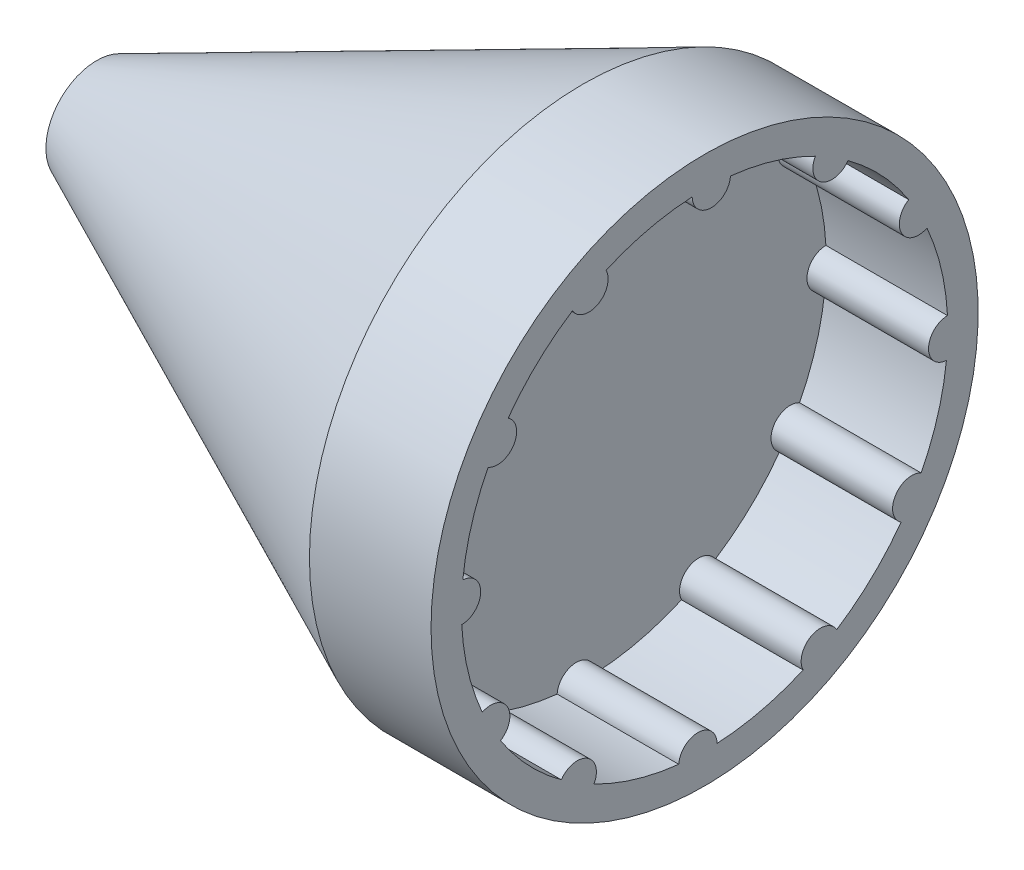
ISO-10303-21;
HEADER;
FILE_DESCRIPTION(('STEP AP214'),'2;1');
FILE_NAME('part.step','',(''),(''),'','','');
FILE_SCHEMA(('AUTOMOTIVE_DESIGN { 1 0 10303 214 1 1 1 1 }'));
ENDSEC;
DATA;
#1=APPLICATION_CONTEXT('core data for automotive mechanical design processes');
#2=APPLICATION_PROTOCOL_DEFINITION('international standard','automotive_design',2000,#1);
#3=PRODUCT_CONTEXT('',#1,'mechanical');
#4=PRODUCT('Part','Part','',(#3));
#5=PRODUCT_RELATED_PRODUCT_CATEGORY('part','',(#4));
#6=PRODUCT_DEFINITION_FORMATION('','',#4);
#7=PRODUCT_DEFINITION_CONTEXT('part definition',#1,'design');
#8=PRODUCT_DEFINITION('design','',#6,#7);
#9=PRODUCT_DEFINITION_SHAPE('','',#8);
#10=(LENGTH_UNIT() NAMED_UNIT(*) SI_UNIT(.MILLI.,.METRE.));
#11=(NAMED_UNIT(*) PLANE_ANGLE_UNIT() SI_UNIT($,.RADIAN.));
#12=(NAMED_UNIT(*) SI_UNIT($,.STERADIAN.) SOLID_ANGLE_UNIT());
#13=UNCERTAINTY_MEASURE_WITH_UNIT(LENGTH_MEASURE(1.E-05),#10,'distance_accuracy_value','');
#14=(GEOMETRIC_REPRESENTATION_CONTEXT(3) GLOBAL_UNCERTAINTY_ASSIGNED_CONTEXT((#13)) GLOBAL_UNIT_ASSIGNED_CONTEXT((#10,
#11,#12)) REPRESENTATION_CONTEXT('',''));
#15=CARTESIAN_POINT('',(0.,0.,0.));
#16=DIRECTION('',(0.,0.,1.));
#17=DIRECTION('',(1.,0.,0.));
#18=AXIS2_PLACEMENT_3D('',#15,#16,#17);
#19=CARTESIAN_POINT('',(25.4,0.,0.));
#20=DIRECTION('',(1.,0.,0.));
#21=DIRECTION('',(0.,0.,-1.));
#22=AXIS2_PLACEMENT_3D('',#19,#20,#21);
#23=PLANE('',#22);
#24=CARTESIAN_POINT('',(25.4,11.1704359452161,6.04246313963302));
#25=DIRECTION('',(-1.,0.,0.));
#26=DIRECTION('',(0.,0.,1.));
#27=AXIS2_PLACEMENT_3D('',#24,#25,#26);
#28=CIRCLE('',#27,1.0011629724573);
#29=CARTESIAN_POINT('',(25.4,10.6597592759748,6.9035883552156));
#30=VERTEX_POINT('',#29);
#31=CARTESIAN_POINT('',(25.4,11.6116945918151,5.14378738930861));
#32=VERTEX_POINT('',#31);
#33=EDGE_CURVE('E350',#30,#32,#28,.F.);
#34=ORIENTED_EDGE('',*,*,#33,.F.);
#35=CARTESIAN_POINT('',(25.4,0.,0.));
#36=DIRECTION('',(-1.,0.,0.));
#37=DIRECTION('',(0.,0.,1.));
#38=AXIS2_PLACEMENT_3D('',#35,#36,#37);
#39=CIRCLE('',#38,12.7);
#40=CARTESIAN_POINT('',(25.4,7.48412880284396,10.2604978467148));
#41=VERTEX_POINT('',#40);
#42=EDGE_CURVE('E354',#30,#41,#39,.F.);
#43=ORIENTED_EDGE('',*,*,#42,.T.);
#44=CARTESIAN_POINT('',(25.4,6.65264973008748,10.8181445529613));
#45=DIRECTION('',(-1.,0.,0.));
#46=DIRECTION('',(0.,0.,1.));
#47=AXIS2_PLACEMENT_3D('',#44,#45,#46);
#48=CIRCLE('',#47,1.0011629724573);
#49=CARTESIAN_POINT('',(25.4,5.77982815361321,11.3085625308745));
#50=VERTEX_POINT('',#49);
#51=EDGE_CURVE('E357',#50,#41,#48,.F.);
#52=ORIENTED_EDGE('',*,*,#51,.F.);
#53=CARTESIAN_POINT('',(25.4,0.,0.));
#54=DIRECTION('',(-1.,0.,0.));
#55=DIRECTION('',(0.,0.,1.));
#56=AXIS2_PLACEMENT_3D('',#53,#54,#55);
#57=CIRCLE('',#56,12.7);
#58=CARTESIAN_POINT('',(25.4,1.35119674510025,12.6279161921526));
#59=VERTEX_POINT('',#58);
#60=EDGE_CURVE('E189',#50,#59,#57,.F.);
#61=ORIENTED_EDGE('',*,*,#60,.T.);
#62=CARTESIAN_POINT('',(25.4,0.352291392254771,12.6951128697205));
#63=DIRECTION('',(-1.,0.,0.));
#64=DIRECTION('',(0.,0.,1.));
#65=AXIS2_PLACEMENT_3D('',#62,#63,#64);
#66=CIRCLE('',#65,1.0011629724573);
#67=CARTESIAN_POINT('',(25.4,-0.648803254899746,12.6834165088288));
#68=VERTEX_POINT('',#67);
#69=EDGE_CURVE('E186',#68,#59,#66,.F.);
#70=ORIENTED_EDGE('',*,*,#69,.F.);
#71=CARTESIAN_POINT('',(25.4,0.,0.));
#72=DIRECTION('',(-1.,0.,0.));
#73=DIRECTION('',(0.,0.,1.));
#74=AXIS2_PLACEMENT_3D('',#71,#72,#73);
#75=CIRCLE('',#74,12.7);
#76=CARTESIAN_POINT('',(25.4,-5.14378738930864,11.6116945918151));
#77=VERTEX_POINT('',#76);
#78=EDGE_CURVE('E20',#68,#77,#75,.F.);
#79=ORIENTED_EDGE('',*,*,#78,.T.);
#80=CARTESIAN_POINT('',(25.4,-6.04246313963303,11.1704359452161));
#81=DIRECTION('',(-1.,0.,0.));
#82=DIRECTION('',(0.,0.,1.));
#83=AXIS2_PLACEMENT_3D('',#80,#81,#82);
#84=CIRCLE('',#83,1.0011629724573);
#85=CARTESIAN_POINT('',(25.4,-6.90358835521561,10.6597592759748));
#86=VERTEX_POINT('',#85);
#87=EDGE_CURVE('E289',#86,#77,#84,.F.);
#88=ORIENTED_EDGE('',*,*,#87,.F.);
#89=CARTESIAN_POINT('',(25.4,0.,0.));
#90=DIRECTION('',(-1.,0.,0.));
#91=DIRECTION('',(0.,0.,1.));
#92=AXIS2_PLACEMENT_3D('',#89,#90,#91);
#93=CIRCLE('',#92,12.7);
#94=CARTESIAN_POINT('',(25.4,-10.2604978467149,7.48412880284398));
#95=VERTEX_POINT('',#94);
#96=EDGE_CURVE('E291',#86,#95,#93,.F.);
#97=ORIENTED_EDGE('',*,*,#96,.T.);
#98=CARTESIAN_POINT('',(25.4,-10.8181445529613,6.65264973008747));
#99=DIRECTION('',(-1.,0.,0.));
#100=DIRECTION('',(0.,0.,1.));
#101=AXIS2_PLACEMENT_3D('',#98,#99,#100);
#102=CIRCLE('',#101,1.0011629724573);
#103=CARTESIAN_POINT('',(25.4,-11.3085625308746,5.77982815361322));
#104=VERTEX_POINT('',#103);
#105=EDGE_CURVE('E294',#104,#95,#102,.F.);
#106=ORIENTED_EDGE('',*,*,#105,.F.);
#107=CARTESIAN_POINT('',(25.4,0.,0.));
#108=DIRECTION('',(-1.,0.,0.));
#109=DIRECTION('',(0.,0.,1.));
#110=AXIS2_PLACEMENT_3D('',#107,#108,#109);
#111=CIRCLE('',#110,12.7);
#112=CARTESIAN_POINT('',(25.4,-12.6279161921526,1.35119674510025));
#113=VERTEX_POINT('',#112);
#114=EDGE_CURVE('E298',#104,#113,#111,.F.);
#115=ORIENTED_EDGE('',*,*,#114,.T.);
#116=CARTESIAN_POINT('',(25.4,-12.6951128697205,0.352291392254771));
#117=DIRECTION('',(-1.,0.,0.));
#118=DIRECTION('',(0.,0.,1.));
#119=AXIS2_PLACEMENT_3D('',#116,#117,#118);
#120=CIRCLE('',#119,1.0011629724573);
#121=CARTESIAN_POINT('',(25.4,-12.6834165088289,-0.648803254899746));
#122=VERTEX_POINT('',#121);
#123=EDGE_CURVE('E301',#122,#113,#120,.F.);
#124=ORIENTED_EDGE('',*,*,#123,.F.);
#125=CARTESIAN_POINT('',(25.4,0.,0.));
#126=DIRECTION('',(-1.,0.,0.));
#127=DIRECTION('',(0.,0.,1.));
#128=AXIS2_PLACEMENT_3D('',#125,#126,#127);
#129=CIRCLE('',#128,12.7);
#130=CARTESIAN_POINT('',(25.4,-11.6116945918152,-5.14378738930866));
#131=VERTEX_POINT('',#130);
#132=EDGE_CURVE('E305',#122,#131,#129,.F.);
#133=ORIENTED_EDGE('',*,*,#132,.T.);
#134=CARTESIAN_POINT('',(25.4,-11.1704359452161,-6.04246313963303));
#135=DIRECTION('',(-1.,0.,0.));
#136=DIRECTION('',(0.,0.,1.));
#137=AXIS2_PLACEMENT_3D('',#134,#135,#136);
#138=CIRCLE('',#137,1.0011629724573);
#139=CARTESIAN_POINT('',(25.4,-10.6597592759749,-6.90358835521566));
#140=VERTEX_POINT('',#139);
#141=EDGE_CURVE('E308',#140,#131,#138,.F.);
#142=ORIENTED_EDGE('',*,*,#141,.F.);
#143=CARTESIAN_POINT('',(25.4,0.,0.));
#144=DIRECTION('',(-1.,0.,0.));
#145=DIRECTION('',(0.,0.,1.));
#146=AXIS2_PLACEMENT_3D('',#143,#144,#145);
#147=CIRCLE('',#146,12.7);
#148=CARTESIAN_POINT('',(25.4,-7.48412880284404,-10.2604978467149));
#149=VERTEX_POINT('',#148);
#150=EDGE_CURVE('E312',#140,#149,#147,.F.);
#151=ORIENTED_EDGE('',*,*,#150,.T.);
#152=CARTESIAN_POINT('',(25.4,-6.65264973008748,-10.8181445529613));
#153=DIRECTION('',(-1.,0.,0.));
#154=DIRECTION('',(0.,0.,1.));
#155=AXIS2_PLACEMENT_3D('',#152,#153,#154);
#156=CIRCLE('',#155,1.0011629724573);
#157=CARTESIAN_POINT('',(25.4,-5.77982815361328,-11.3085625308747));
#158=VERTEX_POINT('',#157);
#159=EDGE_CURVE('E315',#158,#149,#156,.F.);
#160=ORIENTED_EDGE('',*,*,#159,.F.);
#161=CARTESIAN_POINT('',(25.4,0.,0.));
#162=DIRECTION('',(-1.,0.,0.));
#163=DIRECTION('',(0.,0.,1.));
#164=AXIS2_PLACEMENT_3D('',#161,#162,#163);
#165=CIRCLE('',#164,12.7);
#166=CARTESIAN_POINT('',(25.4,-1.35119674510026,-12.6279161921527));
#167=VERTEX_POINT('',#166);
#168=EDGE_CURVE('E319',#158,#167,#165,.F.);
#169=ORIENTED_EDGE('',*,*,#168,.T.);
#170=CARTESIAN_POINT('',(25.4,-0.352291392254772,-12.6951128697205));
#171=DIRECTION('',(-1.,0.,0.));
#172=DIRECTION('',(0.,0.,1.));
#173=AXIS2_PLACEMENT_3D('',#170,#171,#172);
#174=CIRCLE('',#173,1.0011629724573);
#175=CARTESIAN_POINT('',(25.4,0.648803254899744,-12.6834165088289));
#176=VERTEX_POINT('',#175);
#177=EDGE_CURVE('E322',#176,#167,#174,.F.);
#178=ORIENTED_EDGE('',*,*,#177,.F.);
#179=CARTESIAN_POINT('',(25.4,0.,0.));
#180=DIRECTION('',(-1.,0.,0.));
#181=DIRECTION('',(0.,0.,1.));
#182=AXIS2_PLACEMENT_3D('',#179,#180,#181);
#183=CIRCLE('',#182,12.7);
#184=CARTESIAN_POINT('',(25.4,5.14378738930867,-11.6116945918152));
#185=VERTEX_POINT('',#184);
#186=EDGE_CURVE('E326',#176,#185,#183,.F.);
#187=ORIENTED_EDGE('',*,*,#186,.T.);
#188=CARTESIAN_POINT('',(25.4,6.04246313963303,-11.1704359452161));
#189=DIRECTION('',(-1.,0.,0.));
#190=DIRECTION('',(0.,0.,1.));
#191=AXIS2_PLACEMENT_3D('',#188,#189,#190);
#192=CIRCLE('',#191,1.0011629724573);
#193=CARTESIAN_POINT('',(25.4,6.90358835521566,-10.6597592759749));
#194=VERTEX_POINT('',#193);
#195=EDGE_CURVE('E329',#194,#185,#192,.F.);
#196=ORIENTED_EDGE('',*,*,#195,.F.);
#197=CARTESIAN_POINT('',(25.4,0.,0.));
#198=DIRECTION('',(-1.,0.,0.));
#199=DIRECTION('',(0.,0.,1.));
#200=AXIS2_PLACEMENT_3D('',#197,#198,#199);
#201=CIRCLE('',#200,12.7);
#202=CARTESIAN_POINT('',(25.4,10.2604978467149,-7.48412880284401));
#203=VERTEX_POINT('',#202);
#204=EDGE_CURVE('E333',#194,#203,#201,.F.);
#205=ORIENTED_EDGE('',*,*,#204,.T.);
#206=CARTESIAN_POINT('',(25.4,10.8181445529613,-6.65264973008748));
#207=DIRECTION('',(-1.,0.,0.));
#208=DIRECTION('',(0.,0.,1.));
#209=AXIS2_PLACEMENT_3D('',#206,#207,#208);
#210=CIRCLE('',#209,1.0011629724573);
#211=CARTESIAN_POINT('',(25.4,11.3085625308746,-5.77982815361324));
#212=VERTEX_POINT('',#211);
#213=EDGE_CURVE('E336',#212,#203,#210,.F.);
#214=ORIENTED_EDGE('',*,*,#213,.F.);
#215=CARTESIAN_POINT('',(25.4,0.,0.));
#216=DIRECTION('',(-1.,0.,0.));
#217=DIRECTION('',(0.,0.,1.));
#218=AXIS2_PLACEMENT_3D('',#215,#216,#217);
#219=CIRCLE('',#218,12.7);
#220=CARTESIAN_POINT('',(25.4,12.6279161921526,-1.35119674510026));
#221=VERTEX_POINT('',#220);
#222=EDGE_CURVE('E340',#212,#221,#219,.F.);
#223=ORIENTED_EDGE('',*,*,#222,.T.);
#224=CARTESIAN_POINT('',(25.4,12.6951128697205,-0.352291392254773));
#225=DIRECTION('',(-1.,0.,0.));
#226=DIRECTION('',(0.,0.,1.));
#227=AXIS2_PLACEMENT_3D('',#224,#225,#226);
#228=CIRCLE('',#227,1.0011629724573);
#229=CARTESIAN_POINT('',(25.4,12.6834165088289,0.648803254899744));
#230=VERTEX_POINT('',#229);
#231=EDGE_CURVE('E343',#230,#221,#228,.F.);
#232=ORIENTED_EDGE('',*,*,#231,.F.);
#233=CARTESIAN_POINT('',(25.4,0.,0.));
#234=DIRECTION('',(-1.,0.,0.));
#235=DIRECTION('',(0.,0.,1.));
#236=AXIS2_PLACEMENT_3D('',#233,#234,#235);
#237=CIRCLE('',#236,12.7);
#238=EDGE_CURVE('E347',#230,#32,#237,.F.);
#239=ORIENTED_EDGE('',*,*,#238,.T.);
#240=EDGE_LOOP('',(#34,#43,#52,#61,#70,#79,#88,#97,#106,#115,#124,#133,#142,#151,#160,#169,#178,
#187,#196,#205,#214,#223,#232,#239));
#241=FACE_BOUND('',#240,.T.);
#242=ADVANCED_FACE('F17',(#241),#23,.T.);
#243=CARTESIAN_POINT('',(6.35,0.,0.));
#244=DIRECTION('',(-1.,0.,0.));
#245=DIRECTION('',(0.,0.,1.));
#246=AXIS2_PLACEMENT_3D('',#243,#244,#245);
#247=PLANE('',#246);
#248=CARTESIAN_POINT('',(6.35,0.,0.));
#249=DIRECTION('',(-1.,0.,0.));
#250=DIRECTION('',(0.,0.,1.));
#251=AXIS2_PLACEMENT_3D('',#248,#249,#250);
#252=CIRCLE('',#251,2.5);
#253=CARTESIAN_POINT('',(6.35,0.,2.5));
#254=VERTEX_POINT('',#253);
#255=EDGE_CURVE('E284',#254,#254,#252,.T.);
#256=ORIENTED_EDGE('',*,*,#255,.T.);
#257=EDGE_LOOP('',(#256));
#258=FACE_BOUND('',#257,.T.);
#259=ADVANCED_FACE('F724',(#258),#247,.T.);
#260=CARTESIAN_POINT('',(31.75,0.,0.));
#261=DIRECTION('',(-1.,0.,0.));
#262=DIRECTION('',(0.,0.,1.));
#263=AXIS2_PLACEMENT_3D('',#260,#261,#262);
#264=CYLINDRICAL_SURFACE('',#263,12.7);
#265=DIRECTION('',(-1.,0.,0.));
#266=VECTOR('',#265,1.);
#267=CARTESIAN_POINT('',(31.752,-5.14378738930866,11.6116945918152));
#268=LINE('',#267,#266);
#269=CARTESIAN_POINT('',(31.75,-5.14378738930864,11.6116945918151));
#270=VERTEX_POINT('',#269);
#271=EDGE_CURVE('E181',#77,#270,#268,.F.);
#272=ORIENTED_EDGE('',*,*,#271,.F.);
#273=ORIENTED_EDGE('',*,*,#78,.F.);
#274=DIRECTION('',(-1.,0.,0.));
#275=VECTOR('',#274,1.);
#276=CARTESIAN_POINT('',(31.752,-0.648803254899746,12.6834165088288));
#277=LINE('',#276,#275);
#278=CARTESIAN_POINT('',(31.75,-0.648803254899746,12.6834165088288));
#279=VERTEX_POINT('',#278);
#280=EDGE_CURVE('E178',#279,#68,#277,.T.);
#281=ORIENTED_EDGE('',*,*,#280,.F.);
#282=CARTESIAN_POINT('',(31.75,0.,0.));
#283=DIRECTION('',(-1.,0.,0.));
#284=DIRECTION('',(0.,0.,1.));
#285=AXIS2_PLACEMENT_3D('',#282,#283,#284);
#286=CIRCLE('',#285,12.7);
#287=EDGE_CURVE('E282',#270,#279,#286,.T.);
#288=ORIENTED_EDGE('',*,*,#287,.F.);
#289=EDGE_LOOP('',(#272,#273,#281,#288));
#290=FACE_BOUND('',#289,.T.);
#291=ADVANCED_FACE('F176',(#290),#264,.F.);
#292=CARTESIAN_POINT('',(31.752,0.352291392254771,12.6951128697205));
#293=DIRECTION('',(-1.,0.,0.));
#294=DIRECTION('',(0.,0.,1.));
#295=AXIS2_PLACEMENT_3D('',#292,#293,#294);
#296=CYLINDRICAL_SURFACE('',#295,1.0011629724573);
#297=ORIENTED_EDGE('',*,*,#69,.T.);
#298=DIRECTION('',(-1.,0.,0.));
#299=VECTOR('',#298,1.);
#300=CARTESIAN_POINT('',(31.75,1.35119674510024,12.6279161921526));
#301=LINE('',#300,#299);
#302=CARTESIAN_POINT('',(31.75,1.35119674510025,12.6279161921526));
#303=VERTEX_POINT('',#302);
#304=EDGE_CURVE('E199',#59,#303,#301,.F.);
#305=ORIENTED_EDGE('',*,*,#304,.T.);
#306=CARTESIAN_POINT('',(31.75,0.352291392254771,12.6951128697205));
#307=DIRECTION('',(-1.,0.,0.));
#308=DIRECTION('',(0.,0.,1.));
#309=AXIS2_PLACEMENT_3D('',#306,#307,#308);
#310=CIRCLE('',#309,1.0011629724573);
#311=EDGE_CURVE('E194',#279,#303,#310,.F.);
#312=ORIENTED_EDGE('',*,*,#311,.F.);
#313=ORIENTED_EDGE('',*,*,#280,.T.);
#314=EDGE_LOOP('',(#297,#305,#312,#313));
#315=FACE_BOUND('',#314,.T.);
#316=ADVANCED_FACE('F192',(#315),#296,.T.);
#317=CARTESIAN_POINT('',(31.75,0.,0.));
#318=DIRECTION('',(-1.,0.,0.));
#319=DIRECTION('',(0.,0.,1.));
#320=AXIS2_PLACEMENT_3D('',#317,#318,#319);
#321=CYLINDRICAL_SURFACE('',#320,12.7);
#322=CARTESIAN_POINT('',(31.75,0.,0.));
#323=DIRECTION('',(-1.,0.,0.));
#324=DIRECTION('',(0.,0.,1.));
#325=AXIS2_PLACEMENT_3D('',#322,#323,#324);
#326=CIRCLE('',#325,12.7);
#327=CARTESIAN_POINT('',(31.75,5.77982815361321,11.3085625308745));
#328=VERTEX_POINT('',#327);
#329=EDGE_CURVE('E278',#303,#328,#326,.T.);
#330=ORIENTED_EDGE('',*,*,#329,.F.);
#331=ORIENTED_EDGE('',*,*,#304,.F.);
#332=ORIENTED_EDGE('',*,*,#60,.F.);
#333=DIRECTION('',(-1.,0.,0.));
#334=VECTOR('',#333,1.);
#335=CARTESIAN_POINT('',(31.752,5.77982815361324,11.3085625308746));
#336=LINE('',#335,#334);
#337=EDGE_CURVE('E360',#328,#50,#336,.T.);
#338=ORIENTED_EDGE('',*,*,#337,.F.);
#339=EDGE_LOOP('',(#330,#331,#332,#338));
#340=FACE_BOUND('',#339,.T.);
#341=ADVANCED_FACE('F476',(#340),#321,.F.);
#342=CARTESIAN_POINT('',(31.752,6.65264973008748,10.8181445529613));
#343=DIRECTION('',(-1.,0.,0.));
#344=DIRECTION('',(0.,0.,1.));
#345=AXIS2_PLACEMENT_3D('',#342,#343,#344);
#346=CYLINDRICAL_SURFACE('',#345,1.0011629724573);
#347=ORIENTED_EDGE('',*,*,#51,.T.);
#348=DIRECTION('',(-1.,0.,0.));
#349=VECTOR('',#348,1.);
#350=CARTESIAN_POINT('',(31.75,7.48412880284395,10.2604978467148));
#351=LINE('',#350,#349);
#352=CARTESIAN_POINT('',(31.75,7.48412880284396,10.2604978467148));
#353=VERTEX_POINT('',#352);
#354=EDGE_CURVE('E356',#41,#353,#351,.F.);
#355=ORIENTED_EDGE('',*,*,#354,.T.);
#356=CARTESIAN_POINT('',(31.75,6.65264973008748,10.8181445529613));
#357=DIRECTION('',(-1.,0.,0.));
#358=DIRECTION('',(0.,0.,1.));
#359=AXIS2_PLACEMENT_3D('',#356,#357,#358);
#360=CIRCLE('',#359,1.0011629724573);
#361=EDGE_CURVE('E275',#328,#353,#360,.F.);
#362=ORIENTED_EDGE('',*,*,#361,.F.);
#363=ORIENTED_EDGE('',*,*,#337,.T.);
#364=EDGE_LOOP('',(#347,#355,#362,#363));
#365=FACE_BOUND('',#364,.T.);
#366=ADVANCED_FACE('F474',(#365),#346,.T.);
#367=CARTESIAN_POINT('',(31.75,0.,0.));
#368=DIRECTION('',(-1.,0.,0.));
#369=DIRECTION('',(0.,0.,1.));
#370=AXIS2_PLACEMENT_3D('',#367,#368,#369);
#371=CYLINDRICAL_SURFACE('',#370,12.7);
#372=ORIENTED_EDGE('',*,*,#354,.F.);
#373=ORIENTED_EDGE('',*,*,#42,.F.);
#374=DIRECTION('',(-1.,0.,0.));
#375=VECTOR('',#374,1.);
#376=CARTESIAN_POINT('',(31.752,10.6597592759748,6.90358835521561));
#377=LINE('',#376,#375);
#378=CARTESIAN_POINT('',(31.75,10.6597592759748,6.9035883552156));
#379=VERTEX_POINT('',#378);
#380=EDGE_CURVE('E353',#379,#30,#377,.T.);
#381=ORIENTED_EDGE('',*,*,#380,.F.);
#382=CARTESIAN_POINT('',(31.75,0.,0.));
#383=DIRECTION('',(-1.,0.,0.));
#384=DIRECTION('',(0.,0.,1.));
#385=AXIS2_PLACEMENT_3D('',#382,#383,#384);
#386=CIRCLE('',#385,12.7);
#387=EDGE_CURVE('E272',#353,#379,#386,.T.);
#388=ORIENTED_EDGE('',*,*,#387,.F.);
#389=EDGE_LOOP('',(#372,#373,#381,#388));
#390=FACE_BOUND('',#389,.T.);
#391=ADVANCED_FACE('F473',(#390),#371,.F.);
#392=CARTESIAN_POINT('',(31.752,11.1704359452161,6.04246313963302));
#393=DIRECTION('',(-1.,0.,0.));
#394=DIRECTION('',(0.,0.,1.));
#395=AXIS2_PLACEMENT_3D('',#392,#393,#394);
#396=CYLINDRICAL_SURFACE('',#395,1.0011629724573);
#397=ORIENTED_EDGE('',*,*,#33,.T.);
#398=DIRECTION('',(-1.,0.,0.));
#399=VECTOR('',#398,1.);
#400=CARTESIAN_POINT('',(31.75,11.6116945918151,5.14378738930861));
#401=LINE('',#400,#399);
#402=CARTESIAN_POINT('',(31.75,11.6116945918151,5.14378738930861));
#403=VERTEX_POINT('',#402);
#404=EDGE_CURVE('E349',#32,#403,#401,.F.);
#405=ORIENTED_EDGE('',*,*,#404,.T.);
#406=CARTESIAN_POINT('',(31.75,11.1704359452161,6.04246313963302));
#407=DIRECTION('',(-1.,0.,0.));
#408=DIRECTION('',(0.,0.,1.));
#409=AXIS2_PLACEMENT_3D('',#406,#407,#408);
#410=CIRCLE('',#409,1.0011629724573);
#411=EDGE_CURVE('E269',#379,#403,#410,.F.);
#412=ORIENTED_EDGE('',*,*,#411,.F.);
#413=ORIENTED_EDGE('',*,*,#380,.T.);
#414=EDGE_LOOP('',(#397,#405,#412,#413));
#415=FACE_BOUND('',#414,.T.);
#416=ADVANCED_FACE('F468',(#415),#396,.T.);
#417=CARTESIAN_POINT('',(31.75,0.,0.));
#418=DIRECTION('',(-1.,0.,0.));
#419=DIRECTION('',(0.,0.,1.));
#420=AXIS2_PLACEMENT_3D('',#417,#418,#419);
#421=CYLINDRICAL_SURFACE('',#420,12.7);
#422=ORIENTED_EDGE('',*,*,#404,.F.);
#423=ORIENTED_EDGE('',*,*,#238,.F.);
#424=DIRECTION('',(-1.,0.,0.));
#425=VECTOR('',#424,1.);
#426=CARTESIAN_POINT('',(31.752,12.6834165088289,0.648803254899746));
#427=LINE('',#426,#425);
#428=CARTESIAN_POINT('',(31.75,12.6834165088289,0.648803254899745));
#429=VERTEX_POINT('',#428);
#430=EDGE_CURVE('E346',#429,#230,#427,.T.);
#431=ORIENTED_EDGE('',*,*,#430,.F.);
#432=CARTESIAN_POINT('',(31.75,0.,0.));
#433=DIRECTION('',(-1.,0.,0.));
#434=DIRECTION('',(0.,0.,1.));
#435=AXIS2_PLACEMENT_3D('',#432,#433,#434);
#436=CIRCLE('',#435,12.7);
#437=EDGE_CURVE('E266',#403,#429,#436,.T.);
#438=ORIENTED_EDGE('',*,*,#437,.F.);
#439=EDGE_LOOP('',(#422,#423,#431,#438));
#440=FACE_BOUND('',#439,.T.);
#441=ADVANCED_FACE('F466',(#440),#421,.F.);
#442=CARTESIAN_POINT('',(31.752,12.6951128697205,-0.352291392254773));
#443=DIRECTION('',(-1.,0.,0.));
#444=DIRECTION('',(0.,0.,1.));
#445=AXIS2_PLACEMENT_3D('',#442,#443,#444);
#446=CYLINDRICAL_SURFACE('',#445,1.0011629724573);
#447=ORIENTED_EDGE('',*,*,#231,.T.);
#448=DIRECTION('',(-1.,0.,0.));
#449=VECTOR('',#448,1.);
#450=CARTESIAN_POINT('',(31.75,12.6279161921526,-1.35119674510025));
#451=LINE('',#450,#449);
#452=CARTESIAN_POINT('',(31.75,12.6279161921526,-1.35119674510026));
#453=VERTEX_POINT('',#452);
#454=EDGE_CURVE('E342',#221,#453,#451,.F.);
#455=ORIENTED_EDGE('',*,*,#454,.T.);
#456=CARTESIAN_POINT('',(31.75,12.6951128697205,-0.352291392254773));
#457=DIRECTION('',(-1.,0.,0.));
#458=DIRECTION('',(0.,0.,1.));
#459=AXIS2_PLACEMENT_3D('',#456,#457,#458);
#460=CIRCLE('',#459,1.0011629724573);
#461=EDGE_CURVE('E263',#429,#453,#460,.F.);
#462=ORIENTED_EDGE('',*,*,#461,.F.);
#463=ORIENTED_EDGE('',*,*,#430,.T.);
#464=EDGE_LOOP('',(#447,#455,#462,#463));
#465=FACE_BOUND('',#464,.T.);
#466=ADVANCED_FACE('F461',(#465),#446,.T.);
#467=CARTESIAN_POINT('',(31.75,0.,0.));
#468=DIRECTION('',(-1.,0.,0.));
#469=DIRECTION('',(0.,0.,1.));
#470=AXIS2_PLACEMENT_3D('',#467,#468,#469);
#471=CYLINDRICAL_SURFACE('',#470,12.7);
#472=ORIENTED_EDGE('',*,*,#454,.F.);
#473=ORIENTED_EDGE('',*,*,#222,.F.);
#474=DIRECTION('',(-1.,0.,0.));
#475=VECTOR('',#474,1.);
#476=CARTESIAN_POINT('',(31.752,11.3085625308746,-5.77982815361325));
#477=LINE('',#476,#475);
#478=CARTESIAN_POINT('',(31.75,11.3085625308746,-5.77982815361324));
#479=VERTEX_POINT('',#478);
#480=EDGE_CURVE('E339',#479,#212,#477,.T.);
#481=ORIENTED_EDGE('',*,*,#480,.F.);
#482=CARTESIAN_POINT('',(31.75,0.,0.));
#483=DIRECTION('',(-1.,0.,0.));
#484=DIRECTION('',(0.,0.,1.));
#485=AXIS2_PLACEMENT_3D('',#482,#483,#484);
#486=CIRCLE('',#485,12.7);
#487=EDGE_CURVE('E260',#453,#479,#486,.T.);
#488=ORIENTED_EDGE('',*,*,#487,.F.);
#489=EDGE_LOOP('',(#472,#473,#481,#488));
#490=FACE_BOUND('',#489,.T.);
#491=ADVANCED_FACE('F458',(#490),#471,.F.);
#492=CARTESIAN_POINT('',(31.752,10.8181445529613,-6.65264973008748));
#493=DIRECTION('',(-1.,0.,0.));
#494=DIRECTION('',(0.,0.,1.));
#495=AXIS2_PLACEMENT_3D('',#492,#493,#494);
#496=CYLINDRICAL_SURFACE('',#495,1.0011629724573);
#497=ORIENTED_EDGE('',*,*,#213,.T.);
#498=DIRECTION('',(-1.,0.,0.));
#499=VECTOR('',#498,1.);
#500=CARTESIAN_POINT('',(31.75,10.2604978467149,-7.48412880284399));
#501=LINE('',#500,#499);
#502=CARTESIAN_POINT('',(31.75,10.2604978467149,-7.48412880284401));
#503=VERTEX_POINT('',#502);
#504=EDGE_CURVE('E335',#203,#503,#501,.F.);
#505=ORIENTED_EDGE('',*,*,#504,.T.);
#506=CARTESIAN_POINT('',(31.75,10.8181445529613,-6.65264973008748));
#507=DIRECTION('',(-1.,0.,0.));
#508=DIRECTION('',(0.,0.,1.));
#509=AXIS2_PLACEMENT_3D('',#506,#507,#508);
#510=CIRCLE('',#509,1.0011629724573);
#511=EDGE_CURVE('E257',#479,#503,#510,.F.);
#512=ORIENTED_EDGE('',*,*,#511,.F.);
#513=ORIENTED_EDGE('',*,*,#480,.T.);
#514=EDGE_LOOP('',(#497,#505,#512,#513));
#515=FACE_BOUND('',#514,.T.);
#516=ADVANCED_FACE('F453',(#515),#496,.T.);
#517=CARTESIAN_POINT('',(31.75,0.,0.));
#518=DIRECTION('',(-1.,0.,0.));
#519=DIRECTION('',(0.,0.,1.));
#520=AXIS2_PLACEMENT_3D('',#517,#518,#519);
#521=CYLINDRICAL_SURFACE('',#520,12.7);
#522=ORIENTED_EDGE('',*,*,#504,.F.);
#523=ORIENTED_EDGE('',*,*,#204,.F.);
#524=DIRECTION('',(-1.,0.,0.));
#525=VECTOR('',#524,1.);
#526=CARTESIAN_POINT('',(31.752,6.90358835521567,-10.6597592759749));
#527=LINE('',#526,#525);
#528=CARTESIAN_POINT('',(31.75,6.90358835521566,-10.6597592759749));
#529=VERTEX_POINT('',#528);
#530=EDGE_CURVE('E332',#529,#194,#527,.T.);
#531=ORIENTED_EDGE('',*,*,#530,.F.);
#532=CARTESIAN_POINT('',(31.75,0.,0.));
#533=DIRECTION('',(-1.,0.,0.));
#534=DIRECTION('',(0.,0.,1.));
#535=AXIS2_PLACEMENT_3D('',#532,#533,#534);
#536=CIRCLE('',#535,12.7);
#537=EDGE_CURVE('E254',#503,#529,#536,.T.);
#538=ORIENTED_EDGE('',*,*,#537,.F.);
#539=EDGE_LOOP('',(#522,#523,#531,#538));
#540=FACE_BOUND('',#539,.T.);
#541=ADVANCED_FACE('F450',(#540),#521,.F.);
#542=CARTESIAN_POINT('',(31.752,6.04246313963303,-11.1704359452161));
#543=DIRECTION('',(-1.,0.,0.));
#544=DIRECTION('',(0.,0.,1.));
#545=AXIS2_PLACEMENT_3D('',#542,#543,#544);
#546=CYLINDRICAL_SURFACE('',#545,1.0011629724573);
#547=ORIENTED_EDGE('',*,*,#195,.T.);
#548=DIRECTION('',(-1.,0.,0.));
#549=VECTOR('',#548,1.);
#550=CARTESIAN_POINT('',(31.75,5.14378738930866,-11.6116945918152));
#551=LINE('',#550,#549);
#552=CARTESIAN_POINT('',(31.75,5.14378738930867,-11.6116945918152));
#553=VERTEX_POINT('',#552);
#554=EDGE_CURVE('E328',#185,#553,#551,.F.);
#555=ORIENTED_EDGE('',*,*,#554,.T.);
#556=CARTESIAN_POINT('',(31.75,6.04246313963303,-11.1704359452161));
#557=DIRECTION('',(-1.,0.,0.));
#558=DIRECTION('',(0.,0.,1.));
#559=AXIS2_PLACEMENT_3D('',#556,#557,#558);
#560=CIRCLE('',#559,1.0011629724573);
#561=EDGE_CURVE('E251',#529,#553,#560,.F.);
#562=ORIENTED_EDGE('',*,*,#561,.F.);
#563=ORIENTED_EDGE('',*,*,#530,.T.);
#564=EDGE_LOOP('',(#547,#555,#562,#563));
#565=FACE_BOUND('',#564,.T.);
#566=ADVANCED_FACE('F445',(#565),#546,.T.);
#567=CARTESIAN_POINT('',(31.75,0.,0.));
#568=DIRECTION('',(-1.,0.,0.));
#569=DIRECTION('',(0.,0.,1.));
#570=AXIS2_PLACEMENT_3D('',#567,#568,#569);
#571=CYLINDRICAL_SURFACE('',#570,12.7);
#572=ORIENTED_EDGE('',*,*,#554,.F.);
#573=ORIENTED_EDGE('',*,*,#186,.F.);
#574=DIRECTION('',(-1.,0.,0.));
#575=VECTOR('',#574,1.);
#576=CARTESIAN_POINT('',(31.752,0.648803254899748,-12.683416508829));
#577=LINE('',#576,#575);
#578=CARTESIAN_POINT('',(31.75,0.648803254899747,-12.6834165088289));
#579=VERTEX_POINT('',#578);
#580=EDGE_CURVE('E325',#579,#176,#577,.T.);
#581=ORIENTED_EDGE('',*,*,#580,.F.);
#582=CARTESIAN_POINT('',(31.75,0.,0.));
#583=DIRECTION('',(-1.,0.,0.));
#584=DIRECTION('',(0.,0.,1.));
#585=AXIS2_PLACEMENT_3D('',#582,#583,#584);
#586=CIRCLE('',#585,12.7);
#587=EDGE_CURVE('E248',#553,#579,#586,.T.);
#588=ORIENTED_EDGE('',*,*,#587,.F.);
#589=EDGE_LOOP('',(#572,#573,#581,#588));
#590=FACE_BOUND('',#589,.T.);
#591=ADVANCED_FACE('F442',(#590),#571,.F.);
#592=CARTESIAN_POINT('',(31.752,-0.352291392254772,-12.6951128697205));
#593=DIRECTION('',(-1.,0.,0.));
#594=DIRECTION('',(0.,0.,1.));
#595=AXIS2_PLACEMENT_3D('',#592,#593,#594);
#596=CYLINDRICAL_SURFACE('',#595,1.0011629724573);
#597=ORIENTED_EDGE('',*,*,#177,.T.);
#598=DIRECTION('',(-1.,0.,0.));
#599=VECTOR('',#598,1.);
#600=CARTESIAN_POINT('',(31.75,-1.35119674510025,-12.6279161921527));
#601=LINE('',#600,#599);
#602=CARTESIAN_POINT('',(31.75,-1.35119674510026,-12.6279161921527));
#603=VERTEX_POINT('',#602);
#604=EDGE_CURVE('E321',#167,#603,#601,.F.);
#605=ORIENTED_EDGE('',*,*,#604,.T.);
#606=CARTESIAN_POINT('',(31.75,-0.352291392254772,-12.6951128697205));
#607=DIRECTION('',(-1.,0.,0.));
#608=DIRECTION('',(0.,0.,1.));
#609=AXIS2_PLACEMENT_3D('',#606,#607,#608);
#610=CIRCLE('',#609,1.0011629724573);
#611=EDGE_CURVE('E245',#579,#603,#610,.F.);
#612=ORIENTED_EDGE('',*,*,#611,.F.);
#613=ORIENTED_EDGE('',*,*,#580,.T.);
#614=EDGE_LOOP('',(#597,#605,#612,#613));
#615=FACE_BOUND('',#614,.T.);
#616=ADVANCED_FACE('F437',(#615),#596,.T.);
#617=CARTESIAN_POINT('',(31.75,0.,0.));
#618=DIRECTION('',(-1.,0.,0.));
#619=DIRECTION('',(0.,0.,1.));
#620=AXIS2_PLACEMENT_3D('',#617,#618,#619);
#621=CYLINDRICAL_SURFACE('',#620,12.7);
#622=ORIENTED_EDGE('',*,*,#604,.F.);
#623=ORIENTED_EDGE('',*,*,#168,.F.);
#624=DIRECTION('',(-1.,0.,0.));
#625=VECTOR('',#624,1.);
#626=CARTESIAN_POINT('',(31.752,-5.7798281536133,-11.3085625308747));
#627=LINE('',#626,#625);
#628=CARTESIAN_POINT('',(31.75,-5.77982815361328,-11.3085625308747));
#629=VERTEX_POINT('',#628);
#630=EDGE_CURVE('E318',#629,#158,#627,.T.);
#631=ORIENTED_EDGE('',*,*,#630,.F.);
#632=CARTESIAN_POINT('',(31.75,0.,0.));
#633=DIRECTION('',(-1.,0.,0.));
#634=DIRECTION('',(0.,0.,1.));
#635=AXIS2_PLACEMENT_3D('',#632,#633,#634);
#636=CIRCLE('',#635,12.7);
#637=EDGE_CURVE('E242',#603,#629,#636,.T.);
#638=ORIENTED_EDGE('',*,*,#637,.F.);
#639=EDGE_LOOP('',(#622,#623,#631,#638));
#640=FACE_BOUND('',#639,.T.);
#641=ADVANCED_FACE('F434',(#640),#621,.F.);
#642=CARTESIAN_POINT('',(31.752,-6.65264973008748,-10.8181445529613));
#643=DIRECTION('',(-1.,0.,0.));
#644=DIRECTION('',(0.,0.,1.));
#645=AXIS2_PLACEMENT_3D('',#642,#643,#644);
#646=CYLINDRICAL_SURFACE('',#645,1.0011629724573);
#647=ORIENTED_EDGE('',*,*,#159,.T.);
#648=DIRECTION('',(-1.,0.,0.));
#649=VECTOR('',#648,1.);
#650=CARTESIAN_POINT('',(31.75,-7.48412880284403,-10.2604978467149));
#651=LINE('',#650,#649);
#652=CARTESIAN_POINT('',(31.75,-7.48412880284404,-10.2604978467149));
#653=VERTEX_POINT('',#652);
#654=EDGE_CURVE('E314',#149,#653,#651,.F.);
#655=ORIENTED_EDGE('',*,*,#654,.T.);
#656=CARTESIAN_POINT('',(31.75,-6.65264973008748,-10.8181445529613));
#657=DIRECTION('',(-1.,0.,0.));
#658=DIRECTION('',(0.,0.,1.));
#659=AXIS2_PLACEMENT_3D('',#656,#657,#658);
#660=CIRCLE('',#659,1.0011629724573);
#661=EDGE_CURVE('E239',#629,#653,#660,.F.);
#662=ORIENTED_EDGE('',*,*,#661,.F.);
#663=ORIENTED_EDGE('',*,*,#630,.T.);
#664=EDGE_LOOP('',(#647,#655,#662,#663));
#665=FACE_BOUND('',#664,.T.);
#666=ADVANCED_FACE('F429',(#665),#646,.T.);
#667=CARTESIAN_POINT('',(31.75,0.,0.));
#668=DIRECTION('',(-1.,0.,0.));
#669=DIRECTION('',(0.,0.,1.));
#670=AXIS2_PLACEMENT_3D('',#667,#668,#669);
#671=CYLINDRICAL_SURFACE('',#670,12.7);
#672=ORIENTED_EDGE('',*,*,#654,.F.);
#673=ORIENTED_EDGE('',*,*,#150,.F.);
#674=DIRECTION('',(-1.,0.,0.));
#675=VECTOR('',#674,1.);
#676=CARTESIAN_POINT('',(31.752,-10.6597592759749,-6.90358835521567));
#677=LINE('',#676,#675);
#678=CARTESIAN_POINT('',(31.75,-10.6597592759749,-6.90358835521566));
#679=VERTEX_POINT('',#678);
#680=EDGE_CURVE('E311',#679,#140,#677,.T.);
#681=ORIENTED_EDGE('',*,*,#680,.F.);
#682=CARTESIAN_POINT('',(31.75,0.,0.));
#683=DIRECTION('',(-1.,0.,0.));
#684=DIRECTION('',(0.,0.,1.));
#685=AXIS2_PLACEMENT_3D('',#682,#683,#684);
#686=CIRCLE('',#685,12.7);
#687=EDGE_CURVE('E236',#653,#679,#686,.T.);
#688=ORIENTED_EDGE('',*,*,#687,.F.);
#689=EDGE_LOOP('',(#672,#673,#681,#688));
#690=FACE_BOUND('',#689,.T.);
#691=ADVANCED_FACE('F426',(#690),#671,.F.);
#692=CARTESIAN_POINT('',(31.752,-11.1704359452161,-6.04246313963303));
#693=DIRECTION('',(-1.,0.,0.));
#694=DIRECTION('',(0.,0.,1.));
#695=AXIS2_PLACEMENT_3D('',#692,#693,#694);
#696=CYLINDRICAL_SURFACE('',#695,1.0011629724573);
#697=ORIENTED_EDGE('',*,*,#141,.T.);
#698=DIRECTION('',(-1.,0.,0.));
#699=VECTOR('',#698,1.);
#700=CARTESIAN_POINT('',(31.75,-11.6116945918152,-5.14378738930866));
#701=LINE('',#700,#699);
#702=CARTESIAN_POINT('',(31.75,-11.6116945918152,-5.14378738930866));
#703=VERTEX_POINT('',#702);
#704=EDGE_CURVE('E307',#131,#703,#701,.F.);
#705=ORIENTED_EDGE('',*,*,#704,.T.);
#706=CARTESIAN_POINT('',(31.75,-11.1704359452161,-6.04246313963303));
#707=DIRECTION('',(-1.,0.,0.));
#708=DIRECTION('',(0.,0.,1.));
#709=AXIS2_PLACEMENT_3D('',#706,#707,#708);
#710=CIRCLE('',#709,1.0011629724573);
#711=EDGE_CURVE('E233',#679,#703,#710,.F.);
#712=ORIENTED_EDGE('',*,*,#711,.F.);
#713=ORIENTED_EDGE('',*,*,#680,.T.);
#714=EDGE_LOOP('',(#697,#705,#712,#713));
#715=FACE_BOUND('',#714,.T.);
#716=ADVANCED_FACE('F422',(#715),#696,.T.);
#717=CARTESIAN_POINT('',(31.75,0.,0.));
#718=DIRECTION('',(-1.,0.,0.));
#719=DIRECTION('',(0.,0.,1.));
#720=AXIS2_PLACEMENT_3D('',#717,#718,#719);
#721=CYLINDRICAL_SURFACE('',#720,12.7);
#722=ORIENTED_EDGE('',*,*,#704,.F.);
#723=ORIENTED_EDGE('',*,*,#132,.F.);
#724=DIRECTION('',(-1.,0.,0.));
#725=VECTOR('',#724,1.);
#726=CARTESIAN_POINT('',(31.752,-12.6834165088289,-0.648803254899747));
#727=LINE('',#726,#725);
#728=CARTESIAN_POINT('',(31.75,-12.6834165088289,-0.648803254899747));
#729=VERTEX_POINT('',#728);
#730=EDGE_CURVE('E304',#729,#122,#727,.T.);
#731=ORIENTED_EDGE('',*,*,#730,.F.);
#732=CARTESIAN_POINT('',(31.75,0.,0.));
#733=DIRECTION('',(-1.,0.,0.));
#734=DIRECTION('',(0.,0.,1.));
#735=AXIS2_PLACEMENT_3D('',#732,#733,#734);
#736=CIRCLE('',#735,12.7);
#737=EDGE_CURVE('E230',#703,#729,#736,.T.);
#738=ORIENTED_EDGE('',*,*,#737,.F.);
#739=EDGE_LOOP('',(#722,#723,#731,#738));
#740=FACE_BOUND('',#739,.T.);
#741=ADVANCED_FACE('F419',(#740),#721,.F.);
#742=CARTESIAN_POINT('',(31.752,-12.6951128697205,0.352291392254771));
#743=DIRECTION('',(-1.,0.,0.));
#744=DIRECTION('',(0.,0.,1.));
#745=AXIS2_PLACEMENT_3D('',#742,#743,#744);
#746=CYLINDRICAL_SURFACE('',#745,1.0011629724573);
#747=ORIENTED_EDGE('',*,*,#123,.T.);
#748=DIRECTION('',(-1.,0.,0.));
#749=VECTOR('',#748,1.);
#750=CARTESIAN_POINT('',(31.75,-12.6279161921526,1.35119674510025));
#751=LINE('',#750,#749);
#752=CARTESIAN_POINT('',(31.75,-12.6279161921526,1.35119674510025));
#753=VERTEX_POINT('',#752);
#754=EDGE_CURVE('E300',#113,#753,#751,.F.);
#755=ORIENTED_EDGE('',*,*,#754,.T.);
#756=CARTESIAN_POINT('',(31.75,-12.6951128697205,0.352291392254771));
#757=DIRECTION('',(-1.,0.,0.));
#758=DIRECTION('',(0.,0.,1.));
#759=AXIS2_PLACEMENT_3D('',#756,#757,#758);
#760=CIRCLE('',#759,1.0011629724573);
#761=EDGE_CURVE('E227',#729,#753,#760,.F.);
#762=ORIENTED_EDGE('',*,*,#761,.F.);
#763=ORIENTED_EDGE('',*,*,#730,.T.);
#764=EDGE_LOOP('',(#747,#755,#762,#763));
#765=FACE_BOUND('',#764,.T.);
#766=ADVANCED_FACE('F411',(#765),#746,.T.);
#767=CARTESIAN_POINT('',(31.75,0.,0.));
#768=DIRECTION('',(-1.,0.,0.));
#769=DIRECTION('',(0.,0.,1.));
#770=AXIS2_PLACEMENT_3D('',#767,#768,#769);
#771=CYLINDRICAL_SURFACE('',#770,12.7);
#772=ORIENTED_EDGE('',*,*,#754,.F.);
#773=ORIENTED_EDGE('',*,*,#114,.F.);
#774=DIRECTION('',(-1.,0.,0.));
#775=VECTOR('',#774,1.);
#776=CARTESIAN_POINT('',(31.752,-11.3085625308746,5.77982815361324));
#777=LINE('',#776,#775);
#778=CARTESIAN_POINT('',(31.75,-11.3085625308746,5.77982815361322));
#779=VERTEX_POINT('',#778);
#780=EDGE_CURVE('E297',#779,#104,#777,.T.);
#781=ORIENTED_EDGE('',*,*,#780,.F.);
#782=CARTESIAN_POINT('',(31.75,0.,0.));
#783=DIRECTION('',(-1.,0.,0.));
#784=DIRECTION('',(0.,0.,1.));
#785=AXIS2_PLACEMENT_3D('',#782,#783,#784);
#786=CIRCLE('',#785,12.7);
#787=EDGE_CURVE('E224',#753,#779,#786,.T.);
#788=ORIENTED_EDGE('',*,*,#787,.F.);
#789=EDGE_LOOP('',(#772,#773,#781,#788));
#790=FACE_BOUND('',#789,.T.);
#791=ADVANCED_FACE('F414',(#790),#771,.F.);
#792=CARTESIAN_POINT('',(31.752,-10.8181445529613,6.65264973008747));
#793=DIRECTION('',(-1.,0.,0.));
#794=DIRECTION('',(0.,0.,1.));
#795=AXIS2_PLACEMENT_3D('',#792,#793,#794);
#796=CYLINDRICAL_SURFACE('',#795,1.0011629724573);
#797=ORIENTED_EDGE('',*,*,#105,.T.);
#798=DIRECTION('',(-1.,0.,0.));
#799=VECTOR('',#798,1.);
#800=CARTESIAN_POINT('',(31.75,-10.2604978467149,7.48412880284398));
#801=LINE('',#800,#799);
#802=CARTESIAN_POINT('',(31.75,-10.2604978467149,7.48412880284398));
#803=VERTEX_POINT('',#802);
#804=EDGE_CURVE('E293',#95,#803,#801,.F.);
#805=ORIENTED_EDGE('',*,*,#804,.T.);
#806=CARTESIAN_POINT('',(31.75,-10.8181445529613,6.65264973008747));
#807=DIRECTION('',(-1.,0.,0.));
#808=DIRECTION('',(0.,0.,1.));
#809=AXIS2_PLACEMENT_3D('',#806,#807,#808);
#810=CIRCLE('',#809,1.0011629724573);
#811=EDGE_CURVE('E221',#779,#803,#810,.F.);
#812=ORIENTED_EDGE('',*,*,#811,.F.);
#813=ORIENTED_EDGE('',*,*,#780,.T.);
#814=EDGE_LOOP('',(#797,#805,#812,#813));
#815=FACE_BOUND('',#814,.T.);
#816=ADVANCED_FACE('F405',(#815),#796,.T.);
#817=CARTESIAN_POINT('',(31.75,0.,0.));
#818=DIRECTION('',(-1.,0.,0.));
#819=DIRECTION('',(0.,0.,1.));
#820=AXIS2_PLACEMENT_3D('',#817,#818,#819);
#821=CYLINDRICAL_SURFACE('',#820,12.7);
#822=ORIENTED_EDGE('',*,*,#804,.F.);
#823=ORIENTED_EDGE('',*,*,#96,.F.);
#824=DIRECTION('',(-1.,0.,0.));
#825=VECTOR('',#824,1.);
#826=CARTESIAN_POINT('',(31.752,-6.90358835521562,10.6597592759748));
#827=LINE('',#826,#825);
#828=CARTESIAN_POINT('',(31.75,-6.90358835521561,10.6597592759748));
#829=VERTEX_POINT('',#828);
#830=EDGE_CURVE('E35',#829,#86,#827,.T.);
#831=ORIENTED_EDGE('',*,*,#830,.F.);
#832=CARTESIAN_POINT('',(31.75,0.,0.));
#833=DIRECTION('',(-1.,0.,0.));
#834=DIRECTION('',(0.,0.,1.));
#835=AXIS2_PLACEMENT_3D('',#832,#833,#834);
#836=CIRCLE('',#835,12.7);
#837=EDGE_CURVE('E218',#803,#829,#836,.T.);
#838=ORIENTED_EDGE('',*,*,#837,.F.);
#839=EDGE_LOOP('',(#822,#823,#831,#838));
#840=FACE_BOUND('',#839,.T.);
#841=ADVANCED_FACE('F403',(#840),#821,.F.);
#842=CARTESIAN_POINT('',(31.752,-6.04246313963303,11.1704359452161));
#843=DIRECTION('',(-1.,0.,0.));
#844=DIRECTION('',(0.,0.,1.));
#845=AXIS2_PLACEMENT_3D('',#842,#843,#844);
#846=CYLINDRICAL_SURFACE('',#845,1.0011629724573);
#847=ORIENTED_EDGE('',*,*,#87,.T.);
#848=ORIENTED_EDGE('',*,*,#271,.T.);
#849=CARTESIAN_POINT('',(31.75,-6.04246313963303,11.1704359452161));
#850=DIRECTION('',(-1.,0.,0.));
#851=DIRECTION('',(0.,0.,1.));
#852=AXIS2_PLACEMENT_3D('',#849,#850,#851);
#853=CIRCLE('',#852,1.0011629724573);
#854=EDGE_CURVE('E213',#829,#270,#853,.F.);
#855=ORIENTED_EDGE('',*,*,#854,.F.);
#856=ORIENTED_EDGE('',*,*,#830,.T.);
#857=EDGE_LOOP('',(#847,#848,#855,#856));
#858=FACE_BOUND('',#857,.T.);
#859=ADVANCED_FACE('F398',(#858),#846,.T.);
#860=CARTESIAN_POINT('',(6.35,0.,0.));
#861=DIRECTION('',(-1.,0.,0.));
#862=DIRECTION('',(0.,0.,1.));
#863=AXIS2_PLACEMENT_3D('',#860,#861,#862);
#864=CYLINDRICAL_SURFACE('',#863,2.5);
#865=CARTESIAN_POINT('',(0.,0.,0.));
#866=DIRECTION('',(-1.,0.,0.));
#867=DIRECTION('',(0.,0.,1.));
#868=AXIS2_PLACEMENT_3D('',#865,#866,#867);
#869=CIRCLE('',#868,2.5);
#870=CARTESIAN_POINT('',(0.,0.,2.5));
#871=VERTEX_POINT('',#870);
#872=EDGE_CURVE('E208',#871,#871,#869,.T.);
#873=ORIENTED_EDGE('',*,*,#872,.T.);
#874=EDGE_LOOP('',(#873));
#875=FACE_BOUND('',#874,.T.);
#876=ORIENTED_EDGE('',*,*,#255,.F.);
#877=EDGE_LOOP('',(#876));
#878=FACE_BOUND('',#877,.T.);
#879=ADVANCED_FACE('F504',(#875,#878),#864,.F.);
#880=CARTESIAN_POINT('',(31.75,0.,0.));
#881=DIRECTION('',(1.,0.,0.));
#882=DIRECTION('',(0.,0.,-1.));
#883=AXIS2_PLACEMENT_3D('',#880,#881,#882);
#884=PLANE('',#883);
#885=CARTESIAN_POINT('',(31.75,0.,0.));
#886=DIRECTION('',(-1.,0.,0.));
#887=DIRECTION('',(0.,0.,1.));
#888=AXIS2_PLACEMENT_3D('',#885,#886,#887);
#889=CIRCLE('',#888,14.2875);
#890=CARTESIAN_POINT('',(31.75,0.,14.2875));
#891=VERTEX_POINT('',#890);
#892=EDGE_CURVE('E203',#891,#891,#889,.T.);
#893=ORIENTED_EDGE('',*,*,#892,.F.);
#894=EDGE_LOOP('',(#893));
#895=FACE_BOUND('',#894,.T.);
#896=ORIENTED_EDGE('',*,*,#837,.T.);
#897=ORIENTED_EDGE('',*,*,#854,.T.);
#898=ORIENTED_EDGE('',*,*,#287,.T.);
#899=ORIENTED_EDGE('',*,*,#311,.T.);
#900=ORIENTED_EDGE('',*,*,#329,.T.);
#901=ORIENTED_EDGE('',*,*,#361,.T.);
#902=ORIENTED_EDGE('',*,*,#387,.T.);
#903=ORIENTED_EDGE('',*,*,#411,.T.);
#904=ORIENTED_EDGE('',*,*,#437,.T.);
#905=ORIENTED_EDGE('',*,*,#461,.T.);
#906=ORIENTED_EDGE('',*,*,#487,.T.);
#907=ORIENTED_EDGE('',*,*,#511,.T.);
#908=ORIENTED_EDGE('',*,*,#537,.T.);
#909=ORIENTED_EDGE('',*,*,#561,.T.);
#910=ORIENTED_EDGE('',*,*,#587,.T.);
#911=ORIENTED_EDGE('',*,*,#611,.T.);
#912=ORIENTED_EDGE('',*,*,#637,.T.);
#913=ORIENTED_EDGE('',*,*,#661,.T.);
#914=ORIENTED_EDGE('',*,*,#687,.T.);
#915=ORIENTED_EDGE('',*,*,#711,.T.);
#916=ORIENTED_EDGE('',*,*,#737,.T.);
#917=ORIENTED_EDGE('',*,*,#761,.T.);
#918=ORIENTED_EDGE('',*,*,#787,.T.);
#919=ORIENTED_EDGE('',*,*,#811,.T.);
#920=EDGE_LOOP('',(#896,#897,#898,#899,#900,#901,#902,#903,#904,#905,#906,#907,#908,#909,#910,
#911,#912,#913,#914,#915,#916,#917,#918,#919));
#921=FACE_BOUND('',#920,.T.);
#922=ADVANCED_FACE('F400',(#895,#921),#884,.T.);
#923=CARTESIAN_POINT('',(0.,0.,0.));
#924=DIRECTION('',(1.,0.,0.));
#925=DIRECTION('',(0.,0.,-1.));
#926=AXIS2_PLACEMENT_3D('',#923,#924,#925);
#927=PLANE('',#926);
#928=CARTESIAN_POINT('',(0.,0.,0.));
#929=DIRECTION('',(1.,0.,0.));
#930=DIRECTION('',(0.,0.,-1.));
#931=AXIS2_PLACEMENT_3D('',#928,#929,#930);
#932=CIRCLE('',#931,2.65);
#933=CARTESIAN_POINT('',(0.,0.,-2.65));
#934=VERTEX_POINT('',#933);
#935=EDGE_CURVE('E26',#934,#934,#932,.T.);
#936=ORIENTED_EDGE('',*,*,#935,.F.);
#937=EDGE_LOOP('',(#936));
#938=FACE_BOUND('',#937,.T.);
#939=ORIENTED_EDGE('',*,*,#872,.F.);
#940=EDGE_LOOP('',(#939));
#941=FACE_BOUND('',#940,.T.);
#942=ADVANCED_FACE('F494',(#938,#941),#927,.F.);
#943=CARTESIAN_POINT('',(31.75,0.,0.));
#944=DIRECTION('',(-1.,0.,0.));
#945=DIRECTION('',(0.,0.,1.));
#946=AXIS2_PLACEMENT_3D('',#943,#944,#945);
#947=CYLINDRICAL_SURFACE('',#946,14.2875);
#948=CARTESIAN_POINT('',(25.4,0.,0.));
#949=DIRECTION('',(1.,0.,0.));
#950=DIRECTION('',(0.,0.,-1.));
#951=AXIS2_PLACEMENT_3D('',#948,#949,#950);
#952=CIRCLE('',#951,14.2875);
#953=CARTESIAN_POINT('',(25.4,0.,-14.2875));
#954=VERTEX_POINT('',#953);
#955=EDGE_CURVE('E11',#954,#954,#952,.F.);
#956=ORIENTED_EDGE('',*,*,#955,.F.);
#957=EDGE_LOOP('',(#956));
#958=FACE_BOUND('',#957,.T.);
#959=ORIENTED_EDGE('',*,*,#892,.T.);
#960=EDGE_LOOP('',(#959));
#961=FACE_BOUND('',#960,.T.);
#962=ADVANCED_FACE('F488',(#958,#961),#947,.T.);
#963=CARTESIAN_POINT('',(25.4,0.,0.));
#964=DIRECTION('',(1.,0.,0.));
#965=DIRECTION('',(0.,0.,-1.));
#966=AXIS2_PLACEMENT_3D('',#963,#964,#965);
#967=CONICAL_SURFACE('',#966,14.2875,0.429626706557737);
#968=CARTESIAN_POINT('',(25.4,0.,-14.2875));
#969=CARTESIAN_POINT('',(25.1354166666667,0.,-14.1662760416667));
#970=CARTESIAN_POINT('',(24.8708333333333,0.,-14.0450520833333));
#971=CARTESIAN_POINT('',(24.3416666666667,0.,-13.8026041666667));
#972=CARTESIAN_POINT('',(24.0770833333333,0.,-13.6813802083333));
#973=CARTESIAN_POINT('',(23.5479166666667,0.,-13.4389322916667));
#974=CARTESIAN_POINT('',(23.2833333333333,0.,-13.3177083333333));
#975=CARTESIAN_POINT('',(22.7541666666667,0.,-13.0752604166667));
#976=CARTESIAN_POINT('',(22.4895833333333,0.,-12.9540364583333));
#977=CARTESIAN_POINT('',(21.9604166666667,0.,-12.7115885416667));
#978=CARTESIAN_POINT('',(21.6958333333333,0.,-12.5903645833333));
#979=CARTESIAN_POINT('',(21.1666666666667,0.,-12.3479166666667));
#980=CARTESIAN_POINT('',(20.9020833333333,0.,-12.2266927083333));
#981=CARTESIAN_POINT('',(20.3729166666667,0.,-11.9842447916667));
#982=CARTESIAN_POINT('',(20.1083333333333,0.,-11.8630208333333));
#983=CARTESIAN_POINT('',(19.5791666666667,0.,-11.6205729166667));
#984=CARTESIAN_POINT('',(19.3145833333333,0.,-11.4993489583333));
#985=CARTESIAN_POINT('',(18.7854166666667,0.,-11.2569010416667));
#986=CARTESIAN_POINT('',(18.5208333333333,0.,-11.1356770833333));
#987=CARTESIAN_POINT('',(17.9916666666667,0.,-10.8932291666667));
#988=CARTESIAN_POINT('',(17.7270833333333,0.,-10.7720052083333));
#989=CARTESIAN_POINT('',(17.1979166666667,0.,-10.5295572916667));
#990=CARTESIAN_POINT('',(16.9333333333333,0.,-10.4083333333333));
#991=CARTESIAN_POINT('',(16.4041666666667,0.,-10.1658854166667));
#992=CARTESIAN_POINT('',(16.1395833333333,0.,-10.0446614583333));
#993=CARTESIAN_POINT('',(15.6104166666667,0.,-9.80221354166667));
#994=CARTESIAN_POINT('',(15.3458333333333,0.,-9.68098958333333));
#995=CARTESIAN_POINT('',(14.8166666666667,0.,-9.43854166666666));
#996=CARTESIAN_POINT('',(14.5520833333333,0.,-9.31731770833333));
#997=CARTESIAN_POINT('',(14.0229166666667,0.,-9.07486979166667));
#998=CARTESIAN_POINT('',(13.7583333333333,0.,-8.95364583333333));
#999=CARTESIAN_POINT('',(13.2291666666667,0.,-8.71119791666667));
#1000=CARTESIAN_POINT('',(12.9645833333333,0.,-8.58997395833333));
#1001=CARTESIAN_POINT('',(12.4354166666667,0.,-8.34752604166667));
#1002=CARTESIAN_POINT('',(12.1708333333333,0.,-8.22630208333333));
#1003=CARTESIAN_POINT('',(11.6416666666667,0.,-7.98385416666666));
#1004=CARTESIAN_POINT('',(11.3770833333333,0.,-7.86263020833333));
#1005=CARTESIAN_POINT('',(10.8479166666667,0.,-7.62018229166667));
#1006=CARTESIAN_POINT('',(10.5833333333333,0.,-7.49895833333333));
#1007=CARTESIAN_POINT('',(10.0541666666667,0.,-7.25651041666667));
#1008=CARTESIAN_POINT('',(9.78958333333333,0.,-7.13528645833333));
#1009=CARTESIAN_POINT('',(9.26041666666666,0.,-6.89283854166667));
#1010=CARTESIAN_POINT('',(8.99583333333333,0.,-6.77161458333333));
#1011=CARTESIAN_POINT('',(8.46666666666667,0.,-6.52916666666667));
#1012=CARTESIAN_POINT('',(8.20208333333333,0.,-6.40794270833333));
#1013=CARTESIAN_POINT('',(7.67291666666667,0.,-6.16549479166667));
#1014=CARTESIAN_POINT('',(7.40833333333333,0.,-6.04427083333333));
#1015=CARTESIAN_POINT('',(6.87916666666667,0.,-5.80182291666667));
#1016=CARTESIAN_POINT('',(6.61458333333333,0.,-5.68059895833333));
#1017=CARTESIAN_POINT('',(6.08541666666667,0.,-5.43815104166667));
#1018=CARTESIAN_POINT('',(5.82083333333333,0.,-5.31692708333333));
#1019=CARTESIAN_POINT('',(5.29166666666667,0.,-5.07447916666667));
#1020=CARTESIAN_POINT('',(5.02708333333333,0.,-4.95325520833333));
#1021=CARTESIAN_POINT('',(4.49791666666667,0.,-4.71080729166667));
#1022=CARTESIAN_POINT('',(4.23333333333333,0.,-4.58958333333333));
#1023=CARTESIAN_POINT('',(3.70416666666667,0.,-4.34713541666667));
#1024=CARTESIAN_POINT('',(3.43958333333333,0.,-4.22591145833333));
#1025=CARTESIAN_POINT('',(2.91041666666667,0.,-3.98346354166667));
#1026=CARTESIAN_POINT('',(2.64583333333333,0.,-3.86223958333334));
#1027=CARTESIAN_POINT('',(2.11666666666667,0.,-3.61979166666667));
#1028=CARTESIAN_POINT('',(1.85208333333333,0.,-3.49856770833333));
#1029=CARTESIAN_POINT('',(1.32291666666667,0.,-3.25611979166667));
#1030=CARTESIAN_POINT('',(1.05833333333333,0.,-3.13489583333333));
#1031=CARTESIAN_POINT('',(0.529166666666666,0.,-2.89244791666667));
#1032=CARTESIAN_POINT('',(0.264583333333333,0.,-2.77122395833334));
#1033=CARTESIAN_POINT('',(0.,0.,-2.65));
#1034=B_SPLINE_CURVE_WITH_KNOTS('',3,(#968,#969,#970,#971,#972,#973,#974,#975,#976,#977,#978,
#979,#980,#981,#982,#983,#984,#985,#986,#987,#988,#989,#990,#991,#992,#993,#994,#995,#996,#997,
#998,#999,#1000,#1001,#1002,#1003,#1004,#1005,#1006,#1007,#1008,#1009,#1010,#1011,#1012,#1013,
#1014,#1015,#1016,#1017,#1018,#1019,#1020,#1021,#1022,#1023,#1024,#1025,#1026,#1027,#1028,#1029,
#1030,#1031,#1032,#1033),.UNSPECIFIED.,.F.,.F.,(4,2,2,2,2,2,2,2,2,2,2,2,2,2,2,2,2,2,2,2,2,2,2,2,
2,2,2,2,2,2,2,2,4),(0.,0.873095810988703,1.7461916219774,2.6192874329661,3.4923832439548,
4.3654790549435,5.2385748659322,6.1116706769209,6.9847664879096,7.8578622988983,8.730958109887,
9.6040539208757,10.4771497318644,11.3502455428531,12.2233413538418,13.0964371648305,
13.9695329758192,14.8426287868079,15.7157245977966,16.5888204087853,17.461916219774,
18.3350120307627,19.2081078417514,20.0812036527401,20.9542994637288,21.8273952747175,
22.7004910857062,23.5735868966949,24.4466827076836,25.3197785186723,26.192874329661,
27.0659701406497,27.9390659516384),.UNSPECIFIED.);
#1035=EDGE_CURVE('BSEAM486',#954,#934,#1034,.T.);
#1036=ORIENTED_EDGE('',*,*,#955,.T.);
#1037=ORIENTED_EDGE('',*,*,#935,.T.);
#1038=ORIENTED_EDGE('',*,*,#1035,.T.);
#1039=ORIENTED_EDGE('',*,*,#1035,.F.);
#1040=EDGE_LOOP('',(#1036,#1038,#1037,#1039));
#1041=FACE_BOUND('',#1040,.T.);
#1042=ADVANCED_FACE('F486',(#1041),#967,.T.);
#1043=CLOSED_SHELL('',(#242,#259,#291,#316,#341,#366,#391,#416,#441,#466,#491,#516,#541,#566,
#591,#616,#641,#666,#691,#716,#741,#766,#791,#816,#841,#859,#879,#922,#942,#962,#1042));
#1044=MANIFOLD_SOLID_BREP('B1',#1043);
#1045=ADVANCED_BREP_SHAPE_REPRESENTATION('',(#18,#1044),#14);
#1046=SHAPE_DEFINITION_REPRESENTATION(#9,#1045);
ENDSEC;
END-ISO-10303-21;
